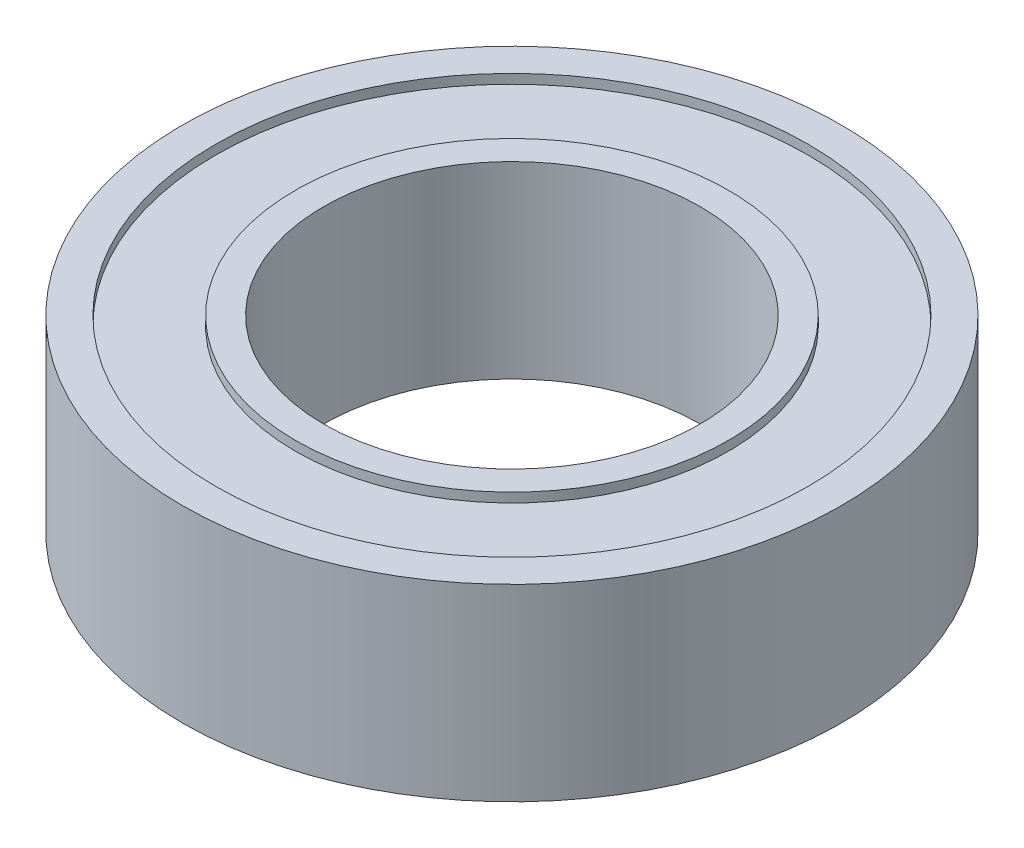
ISO-10303-21;
HEADER;
FILE_DESCRIPTION(('STEP AP214'),'2;1');
FILE_NAME('part.step','',(''),(''),'','','');
FILE_SCHEMA(('AUTOMOTIVE_DESIGN { 1 0 10303 214 1 1 1 1 }'));
ENDSEC;
DATA;
#1=APPLICATION_CONTEXT('core data for automotive mechanical design processes');
#2=APPLICATION_PROTOCOL_DEFINITION('international standard','automotive_design',2000,#1);
#3=PRODUCT_CONTEXT('',#1,'mechanical');
#4=PRODUCT('Part','Part','',(#3));
#5=PRODUCT_RELATED_PRODUCT_CATEGORY('part','',(#4));
#6=PRODUCT_DEFINITION_FORMATION('','',#4);
#7=PRODUCT_DEFINITION_CONTEXT('part definition',#1,'design');
#8=PRODUCT_DEFINITION('design','',#6,#7);
#9=PRODUCT_DEFINITION_SHAPE('','',#8);
#10=(LENGTH_UNIT() NAMED_UNIT(*) SI_UNIT(.MILLI.,.METRE.));
#11=(NAMED_UNIT(*) PLANE_ANGLE_UNIT() SI_UNIT($,.RADIAN.));
#12=(NAMED_UNIT(*) SI_UNIT($,.STERADIAN.) SOLID_ANGLE_UNIT());
#13=UNCERTAINTY_MEASURE_WITH_UNIT(LENGTH_MEASURE(1.E-05),#10,'distance_accuracy_value','');
#14=(GEOMETRIC_REPRESENTATION_CONTEXT(3) GLOBAL_UNCERTAINTY_ASSIGNED_CONTEXT((#13)) GLOBAL_UNIT_ASSIGNED_CONTEXT((#10,
#11,#12)) REPRESENTATION_CONTEXT('',''));
#15=CARTESIAN_POINT('',(0.,0.,0.));
#16=DIRECTION('',(0.,0.,1.));
#17=DIRECTION('',(1.,0.,0.));
#18=AXIS2_PLACEMENT_3D('',#15,#16,#17);
#19=CARTESIAN_POINT('',(0.,-1.,0.));
#20=DIRECTION('',(0.,1.,0.));
#21=DIRECTION('',(0.,0.,1.));
#22=AXIS2_PLACEMENT_3D('',#19,#20,#21);
#23=PLANE('',#22);
#24=CARTESIAN_POINT('',(0.,-1.,0.));
#25=DIRECTION('',(0.,1.,0.));
#26=DIRECTION('',(0.,0.,1.));
#27=AXIS2_PLACEMENT_3D('',#24,#25,#26);
#28=CIRCLE('',#27,2.);
#29=CARTESIAN_POINT('',(0.,-1.,2.));
#30=VERTEX_POINT('',#29);
#31=EDGE_CURVE('E53',#30,#30,#28,.T.);
#32=ORIENTED_EDGE('',*,*,#31,.T.);
#33=EDGE_LOOP('',(#32));
#34=FACE_BOUND('',#33,.T.);
#35=CARTESIAN_POINT('',(0.,-1.,0.));
#36=DIRECTION('',(0.,1.,0.));
#37=DIRECTION('',(0.,0.,1.));
#38=AXIS2_PLACEMENT_3D('',#35,#36,#37);
#39=CIRCLE('',#38,2.30042505215345);
#40=CARTESIAN_POINT('',(0.,-1.,2.30042505215345));
#41=VERTEX_POINT('',#40);
#42=EDGE_CURVE('E77',#41,#41,#39,.T.);
#43=ORIENTED_EDGE('',*,*,#42,.F.);
#44=EDGE_LOOP('',(#43));
#45=FACE_BOUND('',#44,.T.);
#46=ADVANCED_FACE('F40',(#34,#45),#23,.F.);
#47=CARTESIAN_POINT('',(0.,1.,0.));
#48=DIRECTION('',(0.,1.,0.));
#49=DIRECTION('',(0.,0.,1.));
#50=AXIS2_PLACEMENT_3D('',#47,#48,#49);
#51=PLANE('',#50);
#52=CARTESIAN_POINT('',(0.,1.,0.));
#53=DIRECTION('',(0.,1.,0.));
#54=DIRECTION('',(0.,0.,1.));
#55=AXIS2_PLACEMENT_3D('',#52,#53,#54);
#56=CIRCLE('',#55,2.);
#57=CARTESIAN_POINT('',(0.,1.,2.));
#58=VERTEX_POINT('',#57);
#59=EDGE_CURVE('E51',#58,#58,#56,.T.);
#60=ORIENTED_EDGE('',*,*,#59,.F.);
#61=EDGE_LOOP('',(#60));
#62=FACE_BOUND('',#61,.T.);
#63=CARTESIAN_POINT('',(0.,1.,0.));
#64=DIRECTION('',(0.,1.,0.));
#65=DIRECTION('',(0.,0.,1.));
#66=AXIS2_PLACEMENT_3D('',#63,#64,#65);
#67=CIRCLE('',#66,2.30042505215345);
#68=CARTESIAN_POINT('',(0.,1.,2.30042505215345));
#69=VERTEX_POINT('',#68);
#70=EDGE_CURVE('E65',#69,#69,#67,.T.);
#71=ORIENTED_EDGE('',*,*,#70,.T.);
#72=EDGE_LOOP('',(#71));
#73=FACE_BOUND('',#72,.T.);
#74=ADVANCED_FACE('F93',(#62,#73),#51,.T.);
#75=CARTESIAN_POINT('',(0.,1.,0.));
#76=DIRECTION('',(0.,1.,0.));
#77=DIRECTION('',(0.,0.,1.));
#78=AXIS2_PLACEMENT_3D('',#75,#76,#77);
#79=CIRCLE('',#78,3.14689439195164);
#80=CARTESIAN_POINT('',(0.,1.,3.14689439195164));
#81=VERTEX_POINT('',#80);
#82=EDGE_CURVE('E59',#81,#81,#79,.T.);
#83=ORIENTED_EDGE('',*,*,#82,.F.);
#84=EDGE_LOOP('',(#83));
#85=FACE_BOUND('',#84,.T.);
#86=CARTESIAN_POINT('',(0.,1.,0.));
#87=DIRECTION('',(0.,1.,0.));
#88=DIRECTION('',(0.,0.,1.));
#89=AXIS2_PLACEMENT_3D('',#86,#87,#88);
#90=CIRCLE('',#89,3.5);
#91=CARTESIAN_POINT('',(0.,1.,3.5));
#92=VERTEX_POINT('',#91);
#93=EDGE_CURVE('E10',#92,#92,#90,.T.);
#94=ORIENTED_EDGE('',*,*,#93,.T.);
#95=EDGE_LOOP('',(#94));
#96=FACE_BOUND('',#95,.T.);
#97=ADVANCED_FACE('F99',(#85,#96),#51,.T.);
#98=CARTESIAN_POINT('',(0.,-1.,0.));
#99=DIRECTION('',(0.,1.,0.));
#100=DIRECTION('',(0.,0.,1.));
#101=AXIS2_PLACEMENT_3D('',#98,#99,#100);
#102=CIRCLE('',#101,3.14689439195164);
#103=CARTESIAN_POINT('',(0.,-1.,3.14689439195164));
#104=VERTEX_POINT('',#103);
#105=EDGE_CURVE('E71',#104,#104,#102,.T.);
#106=ORIENTED_EDGE('',*,*,#105,.T.);
#107=EDGE_LOOP('',(#106));
#108=FACE_BOUND('',#107,.T.);
#109=CARTESIAN_POINT('',(0.,-1.,0.));
#110=DIRECTION('',(0.,1.,0.));
#111=DIRECTION('',(0.,0.,1.));
#112=AXIS2_PLACEMENT_3D('',#109,#110,#111);
#113=CIRCLE('',#112,3.5);
#114=CARTESIAN_POINT('',(0.,-1.,3.5));
#115=VERTEX_POINT('',#114);
#116=EDGE_CURVE('E44',#115,#115,#113,.T.);
#117=ORIENTED_EDGE('',*,*,#116,.F.);
#118=EDGE_LOOP('',(#117));
#119=FACE_BOUND('',#118,.T.);
#120=ADVANCED_FACE('F95',(#108,#119),#23,.F.);
#121=CARTESIAN_POINT('',(0.,1.,0.));
#122=DIRECTION('',(0.,-1.,0.));
#123=DIRECTION('',(0.,0.,-1.));
#124=AXIS2_PLACEMENT_3D('',#121,#122,#123);
#125=CYLINDRICAL_SURFACE('',#124,3.5);
#126=ORIENTED_EDGE('',*,*,#93,.F.);
#127=EDGE_LOOP('',(#126));
#128=FACE_BOUND('',#127,.T.);
#129=ORIENTED_EDGE('',*,*,#116,.T.);
#130=EDGE_LOOP('',(#129));
#131=FACE_BOUND('',#130,.T.);
#132=ADVANCED_FACE('F42',(#128,#131),#125,.T.);
#133=CARTESIAN_POINT('',(0.,1.,0.));
#134=DIRECTION('',(0.,-1.,0.));
#135=DIRECTION('',(0.,0.,-1.));
#136=AXIS2_PLACEMENT_3D('',#133,#134,#135);
#137=CYLINDRICAL_SURFACE('',#136,2.);
#138=ORIENTED_EDGE('',*,*,#59,.T.);
#139=EDGE_LOOP('',(#138));
#140=FACE_BOUND('',#139,.T.);
#141=ORIENTED_EDGE('',*,*,#31,.F.);
#142=EDGE_LOOP('',(#141));
#143=FACE_BOUND('',#142,.T.);
#144=ADVANCED_FACE('F108',(#140,#143),#137,.F.);
#145=CARTESIAN_POINT('',(0.,0.9,0.));
#146=DIRECTION('',(0.,1.,0.));
#147=DIRECTION('',(0.,0.,1.));
#148=AXIS2_PLACEMENT_3D('',#145,#146,#147);
#149=CYLINDRICAL_SURFACE('',#148,3.14689439195164);
#150=CARTESIAN_POINT('',(0.,0.9,0.));
#151=DIRECTION('',(0.,1.,0.));
#152=DIRECTION('',(0.,0.,1.));
#153=AXIS2_PLACEMENT_3D('',#150,#151,#152);
#154=CIRCLE('',#153,3.14689439195164);
#155=CARTESIAN_POINT('',(0.,0.9,3.14689439195164));
#156=VERTEX_POINT('',#155);
#157=EDGE_CURVE('E56',#156,#156,#154,.T.);
#158=ORIENTED_EDGE('',*,*,#157,.F.);
#159=EDGE_LOOP('',(#158));
#160=FACE_BOUND('',#159,.T.);
#161=ORIENTED_EDGE('',*,*,#82,.T.);
#162=EDGE_LOOP('',(#161));
#163=FACE_BOUND('',#162,.T.);
#164=ADVANCED_FACE('F132',(#160,#163),#149,.F.);
#165=CARTESIAN_POINT('',(0.,0.9,0.));
#166=DIRECTION('',(0.,1.,0.));
#167=DIRECTION('',(0.,0.,1.));
#168=AXIS2_PLACEMENT_3D('',#165,#166,#167);
#169=PLANE('',#168);
#170=CARTESIAN_POINT('',(0.,0.9,0.));
#171=DIRECTION('',(0.,1.,0.));
#172=DIRECTION('',(0.,0.,1.));
#173=AXIS2_PLACEMENT_3D('',#170,#171,#172);
#174=CIRCLE('',#173,2.30042505215345);
#175=CARTESIAN_POINT('',(0.,0.9,2.30042505215345));
#176=VERTEX_POINT('',#175);
#177=EDGE_CURVE('E62',#176,#176,#174,.T.);
#178=ORIENTED_EDGE('',*,*,#177,.F.);
#179=EDGE_LOOP('',(#178));
#180=FACE_BOUND('',#179,.T.);
#181=ORIENTED_EDGE('',*,*,#157,.T.);
#182=EDGE_LOOP('',(#181));
#183=FACE_BOUND('',#182,.T.);
#184=ADVANCED_FACE('F128',(#180,#183),#169,.T.);
#185=CARTESIAN_POINT('',(0.,0.9,0.));
#186=DIRECTION('',(0.,1.,0.));
#187=DIRECTION('',(0.,0.,1.));
#188=AXIS2_PLACEMENT_3D('',#185,#186,#187);
#189=CYLINDRICAL_SURFACE('',#188,2.30042505215345);
#190=ORIENTED_EDGE('',*,*,#177,.T.);
#191=EDGE_LOOP('',(#190));
#192=FACE_BOUND('',#191,.T.);
#193=ORIENTED_EDGE('',*,*,#70,.F.);
#194=EDGE_LOOP('',(#193));
#195=FACE_BOUND('',#194,.T.);
#196=ADVANCED_FACE('F122',(#192,#195),#189,.T.);
#197=CARTESIAN_POINT('',(0.,-0.9,0.));
#198=DIRECTION('',(0.,-1.,0.));
#199=DIRECTION('',(0.,0.,1.));
#200=AXIS2_PLACEMENT_3D('',#197,#198,#199);
#201=PLANE('',#200);
#202=CARTESIAN_POINT('',(0.,-0.9,0.));
#203=DIRECTION('',(0.,1.,0.));
#204=DIRECTION('',(0.,0.,1.));
#205=AXIS2_PLACEMENT_3D('',#202,#203,#204);
#206=CIRCLE('',#205,3.14689439195164);
#207=CARTESIAN_POINT('',(0.,-0.9,3.14689439195164));
#208=VERTEX_POINT('',#207);
#209=EDGE_CURVE('E68',#208,#208,#206,.T.);
#210=ORIENTED_EDGE('',*,*,#209,.F.);
#211=EDGE_LOOP('',(#210));
#212=FACE_BOUND('',#211,.T.);
#213=CARTESIAN_POINT('',(0.,-0.9,0.));
#214=DIRECTION('',(0.,1.,0.));
#215=DIRECTION('',(0.,0.,1.));
#216=AXIS2_PLACEMENT_3D('',#213,#214,#215);
#217=CIRCLE('',#216,2.30042505215345);
#218=CARTESIAN_POINT('',(0.,-0.9,2.30042505215345));
#219=VERTEX_POINT('',#218);
#220=EDGE_CURVE('E74',#219,#219,#217,.T.);
#221=ORIENTED_EDGE('',*,*,#220,.T.);
#222=EDGE_LOOP('',(#221));
#223=FACE_BOUND('',#222,.T.);
#224=ADVANCED_FACE('F83',(#212,#223),#201,.T.);
#225=CARTESIAN_POINT('',(0.,-0.9,0.));
#226=DIRECTION('',(0.,-1.,0.));
#227=DIRECTION('',(0.,0.,-1.));
#228=AXIS2_PLACEMENT_3D('',#225,#226,#227);
#229=CYLINDRICAL_SURFACE('',#228,3.14689439195164);
#230=ORIENTED_EDGE('',*,*,#209,.T.);
#231=EDGE_LOOP('',(#230));
#232=FACE_BOUND('',#231,.T.);
#233=ORIENTED_EDGE('',*,*,#105,.F.);
#234=EDGE_LOOP('',(#233));
#235=FACE_BOUND('',#234,.T.);
#236=ADVANCED_FACE('F88',(#232,#235),#229,.F.);
#237=CARTESIAN_POINT('',(0.,-0.9,0.));
#238=DIRECTION('',(0.,-1.,0.));
#239=DIRECTION('',(0.,0.,-1.));
#240=AXIS2_PLACEMENT_3D('',#237,#238,#239);
#241=CYLINDRICAL_SURFACE('',#240,2.30042505215345);
#242=ORIENTED_EDGE('',*,*,#220,.F.);
#243=EDGE_LOOP('',(#242));
#244=FACE_BOUND('',#243,.T.);
#245=ORIENTED_EDGE('',*,*,#42,.T.);
#246=EDGE_LOOP('',(#245));
#247=FACE_BOUND('',#246,.T.);
#248=ADVANCED_FACE('F85',(#244,#247),#241,.T.);
#249=CLOSED_SHELL('',(#46,#74,#97,#120,#132,#144,#164,#184,#196,#224,#236,#248));
#250=MANIFOLD_SOLID_BREP('B2',#249);
#251=ADVANCED_BREP_SHAPE_REPRESENTATION('',(#18,#250),#14);
#252=SHAPE_DEFINITION_REPRESENTATION(#9,#251);
ENDSEC;
END-ISO-10303-21;
